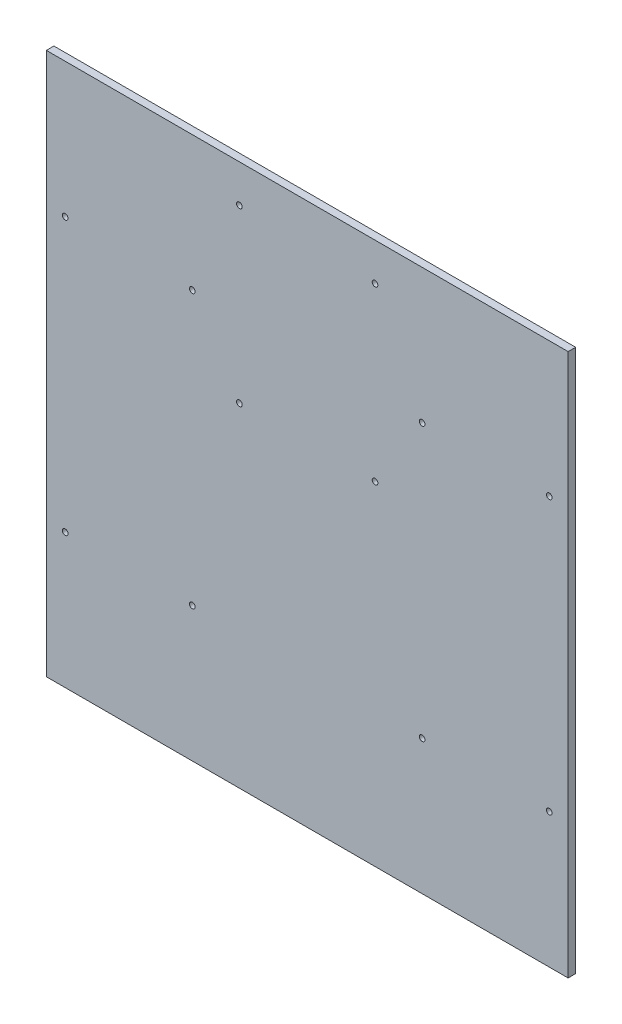
ISO-10303-21;
HEADER;
FILE_DESCRIPTION(('STEP AP214'),'2;1');
FILE_NAME('part.step','',(''),(''),'','','');
FILE_SCHEMA(('AUTOMOTIVE_DESIGN { 1 0 10303 214 1 1 1 1 }'));
ENDSEC;
DATA;
#1=APPLICATION_CONTEXT('core data for automotive mechanical design processes');
#2=APPLICATION_PROTOCOL_DEFINITION('international standard','automotive_design',2000,#1);
#3=PRODUCT_CONTEXT('',#1,'mechanical');
#4=PRODUCT('Part','Part','',(#3));
#5=PRODUCT_RELATED_PRODUCT_CATEGORY('part','',(#4));
#6=PRODUCT_DEFINITION_FORMATION('','',#4);
#7=PRODUCT_DEFINITION_CONTEXT('part definition',#1,'design');
#8=PRODUCT_DEFINITION('design','',#6,#7);
#9=PRODUCT_DEFINITION_SHAPE('','',#8);
#10=(LENGTH_UNIT() NAMED_UNIT(*) SI_UNIT(.MILLI.,.METRE.));
#11=(NAMED_UNIT(*) PLANE_ANGLE_UNIT() SI_UNIT($,.RADIAN.));
#12=(NAMED_UNIT(*) SI_UNIT($,.STERADIAN.) SOLID_ANGLE_UNIT());
#13=UNCERTAINTY_MEASURE_WITH_UNIT(LENGTH_MEASURE(1.E-05),#10,'distance_accuracy_value','');
#14=(GEOMETRIC_REPRESENTATION_CONTEXT(3) GLOBAL_UNCERTAINTY_ASSIGNED_CONTEXT((#13)) GLOBAL_UNIT_ASSIGNED_CONTEXT((#10,
#11,#12)) REPRESENTATION_CONTEXT('',''));
#15=CARTESIAN_POINT('',(0.,0.,0.));
#16=DIRECTION('',(0.,0.,1.));
#17=DIRECTION('',(1.,0.,0.));
#18=AXIS2_PLACEMENT_3D('',#15,#16,#17);
#19=CARTESIAN_POINT('',(-17.0907916429936,-246.819578947368,4.));
#20=DIRECTION('',(0.,0.,1.));
#21=DIRECTION('',(1.,0.,0.));
#22=AXIS2_PLACEMENT_3D('',#19,#20,#21);
#23=PLANE('',#22);
#24=CARTESIAN_POINT('',(157.409208357006,21.1804210526316,4.));
#25=DIRECTION('',(0.,0.,1.));
#26=DIRECTION('',(-1.,0.,0.));
#27=AXIS2_PLACEMENT_3D('',#24,#25,#26);
#28=CIRCLE('',#27,1.5);
#29=CARTESIAN_POINT('',(155.909208357006,21.1804210526316,4.));
#30=VERTEX_POINT('',#29);
#31=EDGE_CURVE('E126',#30,#30,#28,.T.);
#32=ORIENTED_EDGE('',*,*,#31,.F.);
#33=EDGE_LOOP('',(#32));
#34=FACE_BOUND('',#33,.T.);
#35=CARTESIAN_POINT('',(157.409208357006,-69.8195789473685,4.));
#36=DIRECTION('',(0.,0.,1.));
#37=DIRECTION('',(-1.,0.,0.));
#38=AXIS2_PLACEMENT_3D('',#35,#36,#37);
#39=CIRCLE('',#38,1.5);
#40=CARTESIAN_POINT('',(155.909208357006,-69.8195789473685,4.));
#41=VERTEX_POINT('',#40);
#42=EDGE_CURVE('E116',#41,#41,#39,.T.);
#43=ORIENTED_EDGE('',*,*,#42,.F.);
#44=EDGE_LOOP('',(#43));
#45=FACE_BOUND('',#44,.T.);
#46=CARTESIAN_POINT('',(85.4092083570063,-69.8195789473685,4.));
#47=DIRECTION('',(0.,0.,1.));
#48=DIRECTION('',(1.,0.,0.));
#49=AXIS2_PLACEMENT_3D('',#46,#47,#48);
#50=CIRCLE('',#49,1.5);
#51=CARTESIAN_POINT('',(86.9092083570064,-69.8195789473685,4.));
#52=VERTEX_POINT('',#51);
#53=EDGE_CURVE('E113',#52,#52,#50,.T.);
#54=ORIENTED_EDGE('',*,*,#53,.F.);
#55=EDGE_LOOP('',(#54));
#56=FACE_BOUND('',#55,.T.);
#57=CARTESIAN_POINT('',(85.4092083570063,21.1804210526316,4.));
#58=DIRECTION('',(0.,0.,1.));
#59=DIRECTION('',(1.,0.,0.));
#60=AXIS2_PLACEMENT_3D('',#57,#58,#59);
#61=CIRCLE('',#60,1.5);
#62=CARTESIAN_POINT('',(86.9092083570064,21.1804210526316,4.));
#63=VERTEX_POINT('',#62);
#64=EDGE_CURVE('E110',#63,#63,#61,.T.);
#65=ORIENTED_EDGE('',*,*,#64,.F.);
#66=EDGE_LOOP('',(#65));
#67=FACE_BOUND('',#66,.T.);
#68=CARTESIAN_POINT('',(60.4092083570064,-30.3195789473685,4.));
#69=DIRECTION('',(0.,0.,1.));
#70=DIRECTION('',(-1.,0.,0.));
#71=AXIS2_PLACEMENT_3D('',#68,#69,#70);
#72=CIRCLE('',#71,1.5);
#73=CARTESIAN_POINT('',(58.9092083570064,-30.3195789473685,4.));
#74=VERTEX_POINT('',#73);
#75=EDGE_CURVE('E137',#74,#74,#72,.T.);
#76=ORIENTED_EDGE('',*,*,#75,.F.);
#77=EDGE_LOOP('',(#76));
#78=FACE_BOUND('',#77,.T.);
#79=CARTESIAN_POINT('',(-7.09079164299356,-175.319578947368,4.));
#80=DIRECTION('',(0.,0.,1.));
#81=DIRECTION('',(-1.,0.,0.));
#82=AXIS2_PLACEMENT_3D('',#79,#80,#81);
#83=CIRCLE('',#82,1.50000000000002);
#84=CARTESIAN_POINT('',(-8.59079164299358,-175.319578947368,4.));
#85=VERTEX_POINT('',#84);
#86=EDGE_CURVE('E149',#85,#85,#83,.T.);
#87=ORIENTED_EDGE('',*,*,#86,.F.);
#88=EDGE_LOOP('',(#87));
#89=FACE_BOUND('',#88,.T.);
#90=CARTESIAN_POINT('',(249.909208357006,-30.3195789473685,4.));
#91=DIRECTION('',(0.,0.,1.));
#92=DIRECTION('',(1.,0.,0.));
#93=AXIS2_PLACEMENT_3D('',#90,#91,#92);
#94=CIRCLE('',#93,1.50000000000002);
#95=CARTESIAN_POINT('',(251.409208357006,-30.3195789473685,4.));
#96=VERTEX_POINT('',#95);
#97=EDGE_CURVE('E161',#96,#96,#94,.T.);
#98=ORIENTED_EDGE('',*,*,#97,.F.);
#99=EDGE_LOOP('',(#98));
#100=FACE_BOUND('',#99,.T.);
#101=CARTESIAN_POINT('',(182.409208357006,-175.319578947368,4.));
#102=DIRECTION('',(0.,0.,1.));
#103=DIRECTION('',(1.,0.,0.));
#104=AXIS2_PLACEMENT_3D('',#101,#102,#103);
#105=CIRCLE('',#104,1.5);
#106=CARTESIAN_POINT('',(183.909208357006,-175.319578947368,4.));
#107=VERTEX_POINT('',#106);
#108=EDGE_CURVE('E100',#107,#107,#105,.T.);
#109=ORIENTED_EDGE('',*,*,#108,.F.);
#110=EDGE_LOOP('',(#109));
#111=FACE_BOUND('',#110,.T.);
#112=DIRECTION('',(0.,-1.,0.));
#113=VECTOR('',#112,1.);
#114=CARTESIAN_POINT('',(-17.0907916429937,41.1804210526315,4.));
#115=LINE('',#114,#113);
#116=CARTESIAN_POINT('',(-17.0907916429937,41.1804210526315,4.));
#117=VERTEX_POINT('',#116);
#118=CARTESIAN_POINT('',(-17.0907916429936,-246.819578947368,4.));
#119=VERTEX_POINT('',#118);
#120=EDGE_CURVE('E84',#117,#119,#115,.T.);
#121=ORIENTED_EDGE('',*,*,#120,.T.);
#122=DIRECTION('',(1.,0.,0.));
#123=VECTOR('',#122,1.);
#124=CARTESIAN_POINT('',(-17.0907916429936,-246.819578947368,4.));
#125=LINE('',#124,#123);
#126=CARTESIAN_POINT('',(259.909208357006,-246.819578947368,4.));
#127=VERTEX_POINT('',#126);
#128=EDGE_CURVE('E79',#119,#127,#125,.T.);
#129=ORIENTED_EDGE('',*,*,#128,.T.);
#130=DIRECTION('',(0.,1.,0.));
#131=VECTOR('',#130,1.);
#132=CARTESIAN_POINT('',(259.909208357006,41.1804210526315,4.));
#133=LINE('',#132,#131);
#134=CARTESIAN_POINT('',(259.909208357006,41.1804210526315,4.));
#135=VERTEX_POINT('',#134);
#136=EDGE_CURVE('E82',#127,#135,#133,.T.);
#137=ORIENTED_EDGE('',*,*,#136,.T.);
#138=DIRECTION('',(-1.,0.,0.));
#139=VECTOR('',#138,1.);
#140=CARTESIAN_POINT('',(-17.0907916429937,41.1804210526315,4.));
#141=LINE('',#140,#139);
#142=EDGE_CURVE('E49',#135,#117,#141,.T.);
#143=ORIENTED_EDGE('',*,*,#142,.T.);
#144=EDGE_LOOP('',(#121,#129,#137,#143));
#145=FACE_BOUND('',#144,.T.);
#146=CARTESIAN_POINT('',(182.409208357006,-30.3195789473685,4.));
#147=DIRECTION('',(0.,0.,1.));
#148=DIRECTION('',(1.,0.,0.));
#149=AXIS2_PLACEMENT_3D('',#146,#147,#148);
#150=CIRCLE('',#149,1.5);
#151=CARTESIAN_POINT('',(183.909208357006,-30.3195789473685,4.));
#152=VERTEX_POINT('',#151);
#153=EDGE_CURVE('E167',#152,#152,#150,.T.);
#154=ORIENTED_EDGE('',*,*,#153,.F.);
#155=EDGE_LOOP('',(#154));
#156=FACE_BOUND('',#155,.T.);
#157=CARTESIAN_POINT('',(249.909208357006,-175.319578947368,4.));
#158=DIRECTION('',(0.,0.,1.));
#159=DIRECTION('',(1.,0.,0.));
#160=AXIS2_PLACEMENT_3D('',#157,#158,#159);
#161=CIRCLE('',#160,1.50000000000005);
#162=CARTESIAN_POINT('',(251.409208357006,-175.319578947368,4.));
#163=VERTEX_POINT('',#162);
#164=EDGE_CURVE('E155',#163,#163,#161,.T.);
#165=ORIENTED_EDGE('',*,*,#164,.F.);
#166=EDGE_LOOP('',(#165));
#167=FACE_BOUND('',#166,.T.);
#168=CARTESIAN_POINT('',(-7.09079164299359,-30.3195789473685,4.));
#169=DIRECTION('',(0.,0.,1.));
#170=DIRECTION('',(-1.,0.,0.));
#171=AXIS2_PLACEMENT_3D('',#168,#169,#170);
#172=CIRCLE('',#171,1.50000000000003);
#173=CARTESIAN_POINT('',(-8.59079164299361,-30.3195789473685,4.));
#174=VERTEX_POINT('',#173);
#175=EDGE_CURVE('E143',#174,#174,#172,.T.);
#176=ORIENTED_EDGE('',*,*,#175,.F.);
#177=EDGE_LOOP('',(#176));
#178=FACE_BOUND('',#177,.T.);
#179=CARTESIAN_POINT('',(60.4092083570064,-175.319578947368,4.));
#180=DIRECTION('',(0.,0.,1.));
#181=DIRECTION('',(-1.,0.,0.));
#182=AXIS2_PLACEMENT_3D('',#179,#180,#181);
#183=CIRCLE('',#182,1.5);
#184=CARTESIAN_POINT('',(58.9092083570064,-175.319578947368,4.));
#185=VERTEX_POINT('',#184);
#186=EDGE_CURVE('E131',#185,#185,#183,.T.);
#187=ORIENTED_EDGE('',*,*,#186,.F.);
#188=EDGE_LOOP('',(#187));
#189=FACE_BOUND('',#188,.T.);
#190=ADVANCED_FACE('F30',(#34,#45,#56,#67,#78,#89,#100,#111,#145,#156,#167,#178,#189),#23,.T.);
#191=CARTESIAN_POINT('',(-17.0907916429936,-246.819578947368,0.));
#192=DIRECTION('',(0.,0.,1.));
#193=DIRECTION('',(1.,0.,0.));
#194=AXIS2_PLACEMENT_3D('',#191,#192,#193);
#195=PLANE('',#194);
#196=CARTESIAN_POINT('',(157.409208357006,21.1804210526316,0.));
#197=DIRECTION('',(0.,0.,1.));
#198=DIRECTION('',(1.,0.,0.));
#199=AXIS2_PLACEMENT_3D('',#196,#197,#198);
#200=CIRCLE('',#199,1.5);
#201=CARTESIAN_POINT('',(158.909208357006,21.1804210526316,0.));
#202=VERTEX_POINT('',#201);
#203=EDGE_CURVE('E34',#202,#202,#200,.T.);
#204=ORIENTED_EDGE('',*,*,#203,.T.);
#205=EDGE_LOOP('',(#204));
#206=FACE_BOUND('',#205,.T.);
#207=CARTESIAN_POINT('',(157.409208357006,-69.8195789473685,0.));
#208=DIRECTION('',(0.,0.,1.));
#209=DIRECTION('',(1.,0.,0.));
#210=AXIS2_PLACEMENT_3D('',#207,#208,#209);
#211=CIRCLE('',#210,1.5);
#212=CARTESIAN_POINT('',(158.909208357006,-69.8195789473685,0.));
#213=VERTEX_POINT('',#212);
#214=EDGE_CURVE('E114',#213,#213,#211,.T.);
#215=ORIENTED_EDGE('',*,*,#214,.T.);
#216=EDGE_LOOP('',(#215));
#217=FACE_BOUND('',#216,.T.);
#218=CARTESIAN_POINT('',(85.4092083570063,-69.8195789473685,0.));
#219=DIRECTION('',(0.,0.,1.));
#220=DIRECTION('',(1.,0.,0.));
#221=AXIS2_PLACEMENT_3D('',#218,#219,#220);
#222=CIRCLE('',#221,1.5);
#223=CARTESIAN_POINT('',(86.9092083570064,-69.8195789473685,0.));
#224=VERTEX_POINT('',#223);
#225=EDGE_CURVE('E111',#224,#224,#222,.T.);
#226=ORIENTED_EDGE('',*,*,#225,.T.);
#227=EDGE_LOOP('',(#226));
#228=FACE_BOUND('',#227,.T.);
#229=CARTESIAN_POINT('',(85.4092083570063,21.1804210526316,0.));
#230=DIRECTION('',(0.,0.,1.));
#231=DIRECTION('',(1.,0.,0.));
#232=AXIS2_PLACEMENT_3D('',#229,#230,#231);
#233=CIRCLE('',#232,1.5);
#234=CARTESIAN_POINT('',(86.9092083570064,21.1804210526316,0.));
#235=VERTEX_POINT('',#234);
#236=EDGE_CURVE('E106',#235,#235,#233,.T.);
#237=ORIENTED_EDGE('',*,*,#236,.T.);
#238=EDGE_LOOP('',(#237));
#239=FACE_BOUND('',#238,.T.);
#240=CARTESIAN_POINT('',(60.4092083570064,-30.3195789473685,0.));
#241=DIRECTION('',(0.,0.,1.));
#242=DIRECTION('',(-1.,0.,0.));
#243=AXIS2_PLACEMENT_3D('',#240,#241,#242);
#244=CIRCLE('',#243,1.5);
#245=CARTESIAN_POINT('',(58.9092083570064,-30.3195789473685,0.));
#246=VERTEX_POINT('',#245);
#247=EDGE_CURVE('E134',#246,#246,#244,.T.);
#248=ORIENTED_EDGE('',*,*,#247,.T.);
#249=EDGE_LOOP('',(#248));
#250=FACE_BOUND('',#249,.T.);
#251=CARTESIAN_POINT('',(-7.09079164299356,-175.319578947368,0.));
#252=DIRECTION('',(0.,0.,1.));
#253=DIRECTION('',(-1.,0.,0.));
#254=AXIS2_PLACEMENT_3D('',#251,#252,#253);
#255=CIRCLE('',#254,1.50000000000002);
#256=CARTESIAN_POINT('',(-8.59079164299358,-175.319578947368,0.));
#257=VERTEX_POINT('',#256);
#258=EDGE_CURVE('E146',#257,#257,#255,.T.);
#259=ORIENTED_EDGE('',*,*,#258,.T.);
#260=EDGE_LOOP('',(#259));
#261=FACE_BOUND('',#260,.T.);
#262=CARTESIAN_POINT('',(249.909208357006,-30.3195789473685,0.));
#263=DIRECTION('',(0.,0.,1.));
#264=DIRECTION('',(1.,0.,0.));
#265=AXIS2_PLACEMENT_3D('',#262,#263,#264);
#266=CIRCLE('',#265,1.50000000000002);
#267=CARTESIAN_POINT('',(251.409208357006,-30.3195789473685,0.));
#268=VERTEX_POINT('',#267);
#269=EDGE_CURVE('E158',#268,#268,#266,.T.);
#270=ORIENTED_EDGE('',*,*,#269,.T.);
#271=EDGE_LOOP('',(#270));
#272=FACE_BOUND('',#271,.T.);
#273=CARTESIAN_POINT('',(182.409208357006,-175.319578947368,0.));
#274=DIRECTION('',(0.,0.,1.));
#275=DIRECTION('',(1.,0.,0.));
#276=AXIS2_PLACEMENT_3D('',#273,#274,#275);
#277=CIRCLE('',#276,1.5);
#278=CARTESIAN_POINT('',(183.909208357006,-175.319578947368,0.));
#279=VERTEX_POINT('',#278);
#280=EDGE_CURVE('E170',#279,#279,#277,.T.);
#281=ORIENTED_EDGE('',*,*,#280,.T.);
#282=EDGE_LOOP('',(#281));
#283=FACE_BOUND('',#282,.T.);
#284=DIRECTION('',(0.,-1.,0.));
#285=VECTOR('',#284,1.);
#286=CARTESIAN_POINT('',(-17.0907916429937,41.1804210526315,0.));
#287=LINE('',#286,#285);
#288=CARTESIAN_POINT('',(-17.0907916429937,41.1804210526315,0.));
#289=VERTEX_POINT('',#288);
#290=CARTESIAN_POINT('',(-17.0907916429936,-246.819578947368,0.));
#291=VERTEX_POINT('',#290);
#292=EDGE_CURVE('E97',#289,#291,#287,.T.);
#293=ORIENTED_EDGE('',*,*,#292,.F.);
#294=DIRECTION('',(-1.,0.,0.));
#295=VECTOR('',#294,1.);
#296=CARTESIAN_POINT('',(-17.0907916429937,41.1804210526315,0.));
#297=LINE('',#296,#295);
#298=CARTESIAN_POINT('',(259.909208357006,41.1804210526315,0.));
#299=VERTEX_POINT('',#298);
#300=EDGE_CURVE('E72',#299,#289,#297,.T.);
#301=ORIENTED_EDGE('',*,*,#300,.F.);
#302=DIRECTION('',(0.,1.,0.));
#303=VECTOR('',#302,1.);
#304=CARTESIAN_POINT('',(259.909208357006,41.1804210526315,0.));
#305=LINE('',#304,#303);
#306=CARTESIAN_POINT('',(259.909208357006,-246.819578947368,0.));
#307=VERTEX_POINT('',#306);
#308=EDGE_CURVE('E66',#307,#299,#305,.T.);
#309=ORIENTED_EDGE('',*,*,#308,.F.);
#310=DIRECTION('',(1.,0.,0.));
#311=VECTOR('',#310,1.);
#312=CARTESIAN_POINT('',(-17.0907916429936,-246.819578947368,0.));
#313=LINE('',#312,#311);
#314=EDGE_CURVE('E88',#291,#307,#313,.T.);
#315=ORIENTED_EDGE('',*,*,#314,.F.);
#316=EDGE_LOOP('',(#293,#301,#309,#315));
#317=FACE_BOUND('',#316,.T.);
#318=CARTESIAN_POINT('',(182.409208357006,-30.3195789473685,0.));
#319=DIRECTION('',(0.,0.,1.));
#320=DIRECTION('',(1.,0.,0.));
#321=AXIS2_PLACEMENT_3D('',#318,#319,#320);
#322=CIRCLE('',#321,1.5);
#323=CARTESIAN_POINT('',(183.909208357006,-30.3195789473685,0.));
#324=VERTEX_POINT('',#323);
#325=EDGE_CURVE('E164',#324,#324,#322,.T.);
#326=ORIENTED_EDGE('',*,*,#325,.T.);
#327=EDGE_LOOP('',(#326));
#328=FACE_BOUND('',#327,.T.);
#329=CARTESIAN_POINT('',(249.909208357006,-175.319578947368,0.));
#330=DIRECTION('',(0.,0.,1.));
#331=DIRECTION('',(1.,0.,0.));
#332=AXIS2_PLACEMENT_3D('',#329,#330,#331);
#333=CIRCLE('',#332,1.50000000000005);
#334=CARTESIAN_POINT('',(251.409208357006,-175.319578947368,0.));
#335=VERTEX_POINT('',#334);
#336=EDGE_CURVE('E152',#335,#335,#333,.T.);
#337=ORIENTED_EDGE('',*,*,#336,.T.);
#338=EDGE_LOOP('',(#337));
#339=FACE_BOUND('',#338,.T.);
#340=CARTESIAN_POINT('',(-7.09079164299359,-30.3195789473685,0.));
#341=DIRECTION('',(0.,0.,1.));
#342=DIRECTION('',(-1.,0.,0.));
#343=AXIS2_PLACEMENT_3D('',#340,#341,#342);
#344=CIRCLE('',#343,1.50000000000003);
#345=CARTESIAN_POINT('',(-8.59079164299361,-30.3195789473685,0.));
#346=VERTEX_POINT('',#345);
#347=EDGE_CURVE('E140',#346,#346,#344,.T.);
#348=ORIENTED_EDGE('',*,*,#347,.T.);
#349=EDGE_LOOP('',(#348));
#350=FACE_BOUND('',#349,.T.);
#351=CARTESIAN_POINT('',(60.4092083570064,-175.319578947368,0.));
#352=DIRECTION('',(0.,0.,1.));
#353=DIRECTION('',(-1.,0.,0.));
#354=AXIS2_PLACEMENT_3D('',#351,#352,#353);
#355=CIRCLE('',#354,1.5);
#356=CARTESIAN_POINT('',(58.9092083570064,-175.319578947368,0.));
#357=VERTEX_POINT('',#356);
#358=EDGE_CURVE('E109',#357,#357,#355,.T.);
#359=ORIENTED_EDGE('',*,*,#358,.T.);
#360=EDGE_LOOP('',(#359));
#361=FACE_BOUND('',#360,.T.);
#362=ADVANCED_FACE('F178',(#206,#217,#228,#239,#250,#261,#272,#283,#317,#328,#339,#350,#361),
#195,.F.);
#363=CARTESIAN_POINT('',(-17.0907916429937,41.1804210526315,4.));
#364=DIRECTION('',(1.,0.,0.));
#365=DIRECTION('',(0.,1.,0.));
#366=AXIS2_PLACEMENT_3D('',#363,#364,#365);
#367=PLANE('',#366);
#368=ORIENTED_EDGE('',*,*,#292,.T.);
#369=DIRECTION('',(0.,0.,-1.));
#370=VECTOR('',#369,1.);
#371=CARTESIAN_POINT('',(-17.0907916429936,-246.819578947368,4.));
#372=LINE('',#371,#370);
#373=EDGE_CURVE('E11',#119,#291,#372,.T.);
#374=ORIENTED_EDGE('',*,*,#373,.F.);
#375=ORIENTED_EDGE('',*,*,#120,.F.);
#376=DIRECTION('',(0.,0.,-1.));
#377=VECTOR('',#376,1.);
#378=CARTESIAN_POINT('',(-17.0907916429937,41.1804210526315,4.));
#379=LINE('',#378,#377);
#380=EDGE_CURVE('E93',#117,#289,#379,.T.);
#381=ORIENTED_EDGE('',*,*,#380,.T.);
#382=EDGE_LOOP('',(#368,#374,#375,#381));
#383=FACE_BOUND('',#382,.T.);
#384=ADVANCED_FACE('F32',(#383),#367,.F.);
#385=CARTESIAN_POINT('',(-17.0907916429936,-246.819578947368,4.));
#386=DIRECTION('',(0.,1.,0.));
#387=DIRECTION('',(0.,0.,1.));
#388=AXIS2_PLACEMENT_3D('',#385,#386,#387);
#389=PLANE('',#388);
#390=ORIENTED_EDGE('',*,*,#314,.T.);
#391=DIRECTION('',(0.,0.,-1.));
#392=VECTOR('',#391,1.);
#393=CARTESIAN_POINT('',(259.909208357006,-246.819578947368,4.));
#394=LINE('',#393,#392);
#395=EDGE_CURVE('E40',#127,#307,#394,.T.);
#396=ORIENTED_EDGE('',*,*,#395,.F.);
#397=ORIENTED_EDGE('',*,*,#128,.F.);
#398=ORIENTED_EDGE('',*,*,#373,.T.);
#399=EDGE_LOOP('',(#390,#396,#397,#398));
#400=FACE_BOUND('',#399,.T.);
#401=ADVANCED_FACE('F87',(#400),#389,.F.);
#402=CARTESIAN_POINT('',(259.909208357006,41.1804210526315,4.));
#403=DIRECTION('',(-1.,0.,0.));
#404=DIRECTION('',(0.,-1.,0.));
#405=AXIS2_PLACEMENT_3D('',#402,#403,#404);
#406=PLANE('',#405);
#407=ORIENTED_EDGE('',*,*,#308,.T.);
#408=DIRECTION('',(0.,0.,-1.));
#409=VECTOR('',#408,1.);
#410=CARTESIAN_POINT('',(259.909208357006,41.1804210526315,4.));
#411=LINE('',#410,#409);
#412=EDGE_CURVE('E89',#135,#299,#411,.T.);
#413=ORIENTED_EDGE('',*,*,#412,.F.);
#414=ORIENTED_EDGE('',*,*,#136,.F.);
#415=ORIENTED_EDGE('',*,*,#395,.T.);
#416=EDGE_LOOP('',(#407,#413,#414,#415));
#417=FACE_BOUND('',#416,.T.);
#418=ADVANCED_FACE('F91',(#417),#406,.F.);
#419=CARTESIAN_POINT('',(-17.0907916429937,41.1804210526315,4.));
#420=DIRECTION('',(0.,-1.,0.));
#421=DIRECTION('',(0.,0.,-1.));
#422=AXIS2_PLACEMENT_3D('',#419,#420,#421);
#423=PLANE('',#422);
#424=ORIENTED_EDGE('',*,*,#300,.T.);
#425=ORIENTED_EDGE('',*,*,#380,.F.);
#426=ORIENTED_EDGE('',*,*,#142,.F.);
#427=ORIENTED_EDGE('',*,*,#412,.T.);
#428=EDGE_LOOP('',(#424,#425,#426,#427));
#429=FACE_BOUND('',#428,.T.);
#430=ADVANCED_FACE('F184',(#429),#423,.F.);
#431=CARTESIAN_POINT('',(182.409208357006,-175.319578947368,4.));
#432=DIRECTION('',(0.,0.,-1.));
#433=DIRECTION('',(-1.,0.,0.));
#434=AXIS2_PLACEMENT_3D('',#431,#432,#433);
#435=CYLINDRICAL_SURFACE('',#434,1.5);
#436=ORIENTED_EDGE('',*,*,#108,.T.);
#437=EDGE_LOOP('',(#436));
#438=FACE_BOUND('',#437,.T.);
#439=ORIENTED_EDGE('',*,*,#280,.F.);
#440=EDGE_LOOP('',(#439));
#441=FACE_BOUND('',#440,.T.);
#442=ADVANCED_FACE('F181',(#438,#441),#435,.F.);
#443=CARTESIAN_POINT('',(182.409208357006,-30.3195789473685,4.));
#444=DIRECTION('',(0.,0.,-1.));
#445=DIRECTION('',(-1.,0.,0.));
#446=AXIS2_PLACEMENT_3D('',#443,#444,#445);
#447=CYLINDRICAL_SURFACE('',#446,1.5);
#448=ORIENTED_EDGE('',*,*,#153,.T.);
#449=EDGE_LOOP('',(#448));
#450=FACE_BOUND('',#449,.T.);
#451=ORIENTED_EDGE('',*,*,#325,.F.);
#452=EDGE_LOOP('',(#451));
#453=FACE_BOUND('',#452,.T.);
#454=ADVANCED_FACE('F183',(#450,#453),#447,.F.);
#455=CARTESIAN_POINT('',(249.909208357006,-30.3195789473685,4.));
#456=DIRECTION('',(0.,0.,-1.));
#457=DIRECTION('',(-1.,0.,0.));
#458=AXIS2_PLACEMENT_3D('',#455,#456,#457);
#459=CYLINDRICAL_SURFACE('',#458,1.50000000000002);
#460=ORIENTED_EDGE('',*,*,#97,.T.);
#461=EDGE_LOOP('',(#460));
#462=FACE_BOUND('',#461,.T.);
#463=ORIENTED_EDGE('',*,*,#269,.F.);
#464=EDGE_LOOP('',(#463));
#465=FACE_BOUND('',#464,.T.);
#466=ADVANCED_FACE('F191',(#462,#465),#459,.F.);
#467=CARTESIAN_POINT('',(249.909208357006,-175.319578947368,4.));
#468=DIRECTION('',(0.,0.,-1.));
#469=DIRECTION('',(-1.,0.,0.));
#470=AXIS2_PLACEMENT_3D('',#467,#468,#469);
#471=CYLINDRICAL_SURFACE('',#470,1.50000000000005);
#472=ORIENTED_EDGE('',*,*,#164,.T.);
#473=EDGE_LOOP('',(#472));
#474=FACE_BOUND('',#473,.T.);
#475=ORIENTED_EDGE('',*,*,#336,.F.);
#476=EDGE_LOOP('',(#475));
#477=FACE_BOUND('',#476,.T.);
#478=ADVANCED_FACE('F249',(#474,#477),#471,.F.);
#479=CARTESIAN_POINT('',(-7.09079164299356,-175.319578947368,4.));
#480=DIRECTION('',(0.,0.,-1.));
#481=DIRECTION('',(-1.,0.,0.));
#482=AXIS2_PLACEMENT_3D('',#479,#480,#481);
#483=CYLINDRICAL_SURFACE('',#482,1.50000000000002);
#484=ORIENTED_EDGE('',*,*,#86,.T.);
#485=EDGE_LOOP('',(#484));
#486=FACE_BOUND('',#485,.T.);
#487=ORIENTED_EDGE('',*,*,#258,.F.);
#488=EDGE_LOOP('',(#487));
#489=FACE_BOUND('',#488,.T.);
#490=ADVANCED_FACE('F245',(#486,#489),#483,.F.);
#491=CARTESIAN_POINT('',(-7.09079164299359,-30.3195789473685,4.));
#492=DIRECTION('',(0.,0.,-1.));
#493=DIRECTION('',(-1.,0.,0.));
#494=AXIS2_PLACEMENT_3D('',#491,#492,#493);
#495=CYLINDRICAL_SURFACE('',#494,1.50000000000003);
#496=ORIENTED_EDGE('',*,*,#175,.T.);
#497=EDGE_LOOP('',(#496));
#498=FACE_BOUND('',#497,.T.);
#499=ORIENTED_EDGE('',*,*,#347,.F.);
#500=EDGE_LOOP('',(#499));
#501=FACE_BOUND('',#500,.T.);
#502=ADVANCED_FACE('F238',(#498,#501),#495,.F.);
#503=CARTESIAN_POINT('',(60.4092083570064,-30.3195789473685,4.));
#504=DIRECTION('',(0.,0.,-1.));
#505=DIRECTION('',(-1.,0.,0.));
#506=AXIS2_PLACEMENT_3D('',#503,#504,#505);
#507=CYLINDRICAL_SURFACE('',#506,1.5);
#508=ORIENTED_EDGE('',*,*,#75,.T.);
#509=EDGE_LOOP('',(#508));
#510=FACE_BOUND('',#509,.T.);
#511=ORIENTED_EDGE('',*,*,#247,.F.);
#512=EDGE_LOOP('',(#511));
#513=FACE_BOUND('',#512,.T.);
#514=ADVANCED_FACE('F229',(#510,#513),#507,.F.);
#515=CARTESIAN_POINT('',(60.4092083570064,-175.319578947368,4.));
#516=DIRECTION('',(0.,0.,-1.));
#517=DIRECTION('',(-1.,0.,0.));
#518=AXIS2_PLACEMENT_3D('',#515,#516,#517);
#519=CYLINDRICAL_SURFACE('',#518,1.5);
#520=ORIENTED_EDGE('',*,*,#186,.T.);
#521=EDGE_LOOP('',(#520));
#522=FACE_BOUND('',#521,.T.);
#523=ORIENTED_EDGE('',*,*,#358,.F.);
#524=EDGE_LOOP('',(#523));
#525=FACE_BOUND('',#524,.T.);
#526=ADVANCED_FACE('F226',(#522,#525),#519,.F.);
#527=CARTESIAN_POINT('',(85.4092083570063,21.1804210526316,-6.));
#528=DIRECTION('',(0.,0.,1.));
#529=DIRECTION('',(1.,0.,0.));
#530=AXIS2_PLACEMENT_3D('',#527,#528,#529);
#531=CYLINDRICAL_SURFACE('',#530,1.5);
#532=ORIENTED_EDGE('',*,*,#64,.T.);
#533=EDGE_LOOP('',(#532));
#534=FACE_BOUND('',#533,.T.);
#535=ORIENTED_EDGE('',*,*,#236,.F.);
#536=EDGE_LOOP('',(#535));
#537=FACE_BOUND('',#536,.T.);
#538=ADVANCED_FACE('F228',(#534,#537),#531,.F.);
#539=CARTESIAN_POINT('',(85.4092083570063,-69.8195789473685,-6.));
#540=DIRECTION('',(0.,0.,1.));
#541=DIRECTION('',(1.,0.,0.));
#542=AXIS2_PLACEMENT_3D('',#539,#540,#541);
#543=CYLINDRICAL_SURFACE('',#542,1.5);
#544=ORIENTED_EDGE('',*,*,#53,.T.);
#545=EDGE_LOOP('',(#544));
#546=FACE_BOUND('',#545,.T.);
#547=ORIENTED_EDGE('',*,*,#225,.F.);
#548=EDGE_LOOP('',(#547));
#549=FACE_BOUND('',#548,.T.);
#550=ADVANCED_FACE('F235',(#546,#549),#543,.F.);
#551=CARTESIAN_POINT('',(157.409208357006,-69.8195789473685,-6.));
#552=DIRECTION('',(0.,0.,1.));
#553=DIRECTION('',(1.,0.,0.));
#554=AXIS2_PLACEMENT_3D('',#551,#552,#553);
#555=CYLINDRICAL_SURFACE('',#554,1.5);
#556=ORIENTED_EDGE('',*,*,#42,.T.);
#557=EDGE_LOOP('',(#556));
#558=FACE_BOUND('',#557,.T.);
#559=ORIENTED_EDGE('',*,*,#214,.F.);
#560=EDGE_LOOP('',(#559));
#561=FACE_BOUND('',#560,.T.);
#562=ADVANCED_FACE('F302',(#558,#561),#555,.F.);
#563=CARTESIAN_POINT('',(157.409208357006,21.1804210526316,-6.));
#564=DIRECTION('',(0.,0.,1.));
#565=DIRECTION('',(1.,0.,0.));
#566=AXIS2_PLACEMENT_3D('',#563,#564,#565);
#567=CYLINDRICAL_SURFACE('',#566,1.5);
#568=ORIENTED_EDGE('',*,*,#31,.T.);
#569=EDGE_LOOP('',(#568));
#570=FACE_BOUND('',#569,.T.);
#571=ORIENTED_EDGE('',*,*,#203,.F.);
#572=EDGE_LOOP('',(#571));
#573=FACE_BOUND('',#572,.T.);
#574=ADVANCED_FACE('F310',(#570,#573),#567,.F.);
#575=CLOSED_SHELL('',(#190,#362,#384,#401,#418,#430,#442,#454,#466,#478,#490,#502,#514,#526,
#538,#550,#562,#574));
#576=MANIFOLD_SOLID_BREP('B2',#575);
#577=ADVANCED_BREP_SHAPE_REPRESENTATION('',(#18,#576),#14);
#578=SHAPE_DEFINITION_REPRESENTATION(#9,#577);
ENDSEC;
END-ISO-10303-21;
